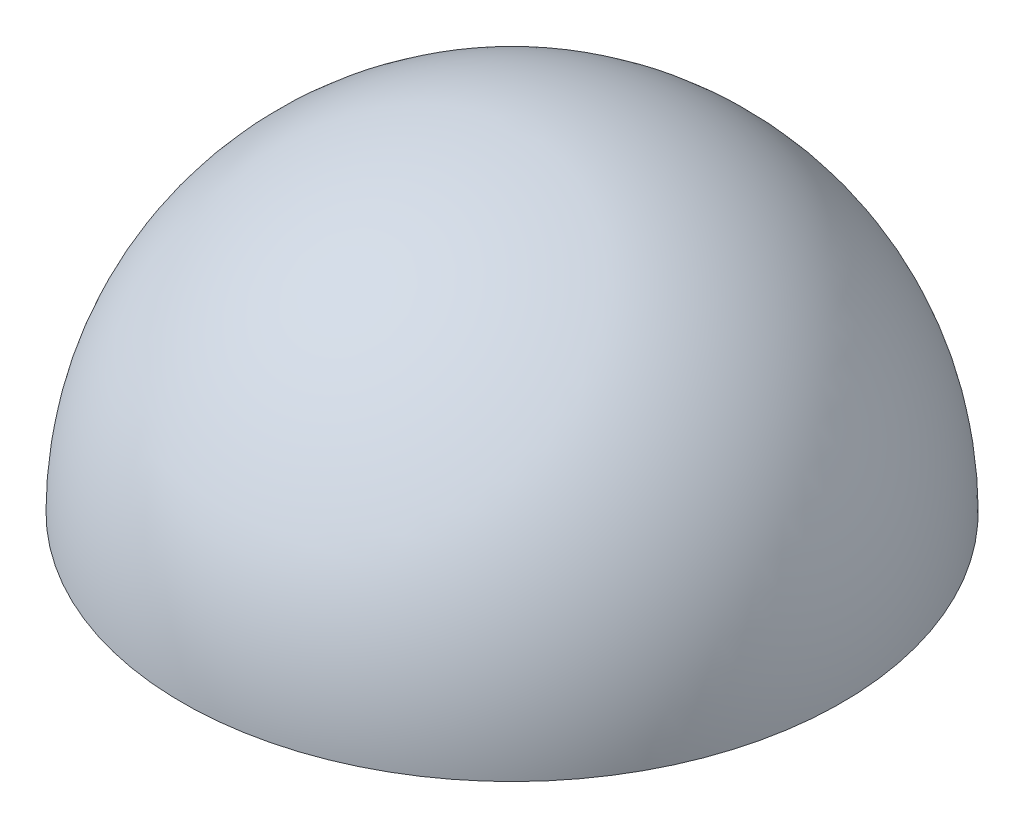
ISO-10303-21;
HEADER;
FILE_DESCRIPTION(('STEP AP214'),'2;1');
FILE_NAME('part.step','',(''),(''),'','','');
FILE_SCHEMA(('AUTOMOTIVE_DESIGN { 1 0 10303 214 1 1 1 1 }'));
ENDSEC;
DATA;
#1=APPLICATION_CONTEXT('core data for automotive mechanical design processes');
#2=APPLICATION_PROTOCOL_DEFINITION('international standard','automotive_design',2000,#1);
#3=PRODUCT_CONTEXT('',#1,'mechanical');
#4=PRODUCT('Part','Part','',(#3));
#5=PRODUCT_RELATED_PRODUCT_CATEGORY('part','',(#4));
#6=PRODUCT_DEFINITION_FORMATION('','',#4);
#7=PRODUCT_DEFINITION_CONTEXT('part definition',#1,'design');
#8=PRODUCT_DEFINITION('design','',#6,#7);
#9=PRODUCT_DEFINITION_SHAPE('','',#8);
#10=(LENGTH_UNIT() NAMED_UNIT(*) SI_UNIT(.MILLI.,.METRE.));
#11=(NAMED_UNIT(*) PLANE_ANGLE_UNIT() SI_UNIT($,.RADIAN.));
#12=(NAMED_UNIT(*) SI_UNIT($,.STERADIAN.) SOLID_ANGLE_UNIT());
#13=UNCERTAINTY_MEASURE_WITH_UNIT(LENGTH_MEASURE(1.E-05),#10,'distance_accuracy_value','');
#14=(GEOMETRIC_REPRESENTATION_CONTEXT(3) GLOBAL_UNCERTAINTY_ASSIGNED_CONTEXT((#13)) GLOBAL_UNIT_ASSIGNED_CONTEXT((#10,
#11,#12)) REPRESENTATION_CONTEXT('',''));
#15=CARTESIAN_POINT('',(0.,0.,0.));
#16=DIRECTION('',(0.,0.,1.));
#17=DIRECTION('',(1.,0.,0.));
#18=AXIS2_PLACEMENT_3D('',#15,#16,#17);
#19=CARTESIAN_POINT('',(0.,0.,0.));
#20=DIRECTION('',(-1.,0.,0.));
#21=DIRECTION('',(0.,0.,1.));
#22=AXIS2_PLACEMENT_3D('',#19,#20,#21);
#23=SPHERICAL_SURFACE('',#22,50.8);
#24=CARTESIAN_POINT('',(0.,0.,0.));
#25=DIRECTION('',(0.,-1.,0.));
#26=DIRECTION('',(0.,0.,-1.));
#27=AXIS2_PLACEMENT_3D('',#24,#25,#26);
#28=SPHERICAL_SURFACE('',#27,50.8);
#29=CARTESIAN_POINT('',(0.,0.,0.));
#30=DIRECTION('',(0.,-1.,0.));
#31=DIRECTION('',(0.,0.,-1.));
#32=AXIS2_PLACEMENT_3D('',#29,#30,#31);
#33=CIRCLE('',#32,50.8);
#34=CARTESIAN_POINT('',(0.,3.54734504026462E-13,-50.8));
#35=VERTEX_POINT('',#34);
#36=EDGE_CURVE('E10',#35,#35,#33,.T.);
#37=ORIENTED_EDGE('',*,*,#36,.F.);
#38=EDGE_LOOP('',(#37));
#39=FACE_BOUND('',#38,.T.);
#40=ADVANCED_FACE('F31',(#39),#28,.T.);
#41=CARTESIAN_POINT('',(0.,0.,0.));
#42=DIRECTION('',(0.,-1.,0.));
#43=DIRECTION('',(0.,0.,-1.));
#44=AXIS2_PLACEMENT_3D('',#41,#42,#43);
#45=PLANE('',#44);
#46=ORIENTED_EDGE('',*,*,#36,.T.);
#47=EDGE_LOOP('',(#46));
#48=FACE_BOUND('',#47,.T.);
#49=ADVANCED_FACE('F38',(#48),#45,.T.);
#50=CLOSED_SHELL('',(#40,#49));
#51=MANIFOLD_SOLID_BREP('B2',#50);
#52=ADVANCED_BREP_SHAPE_REPRESENTATION('',(#18,#51),#14);
#53=SHAPE_DEFINITION_REPRESENTATION(#9,#52);
ENDSEC;
END-ISO-10303-21;
